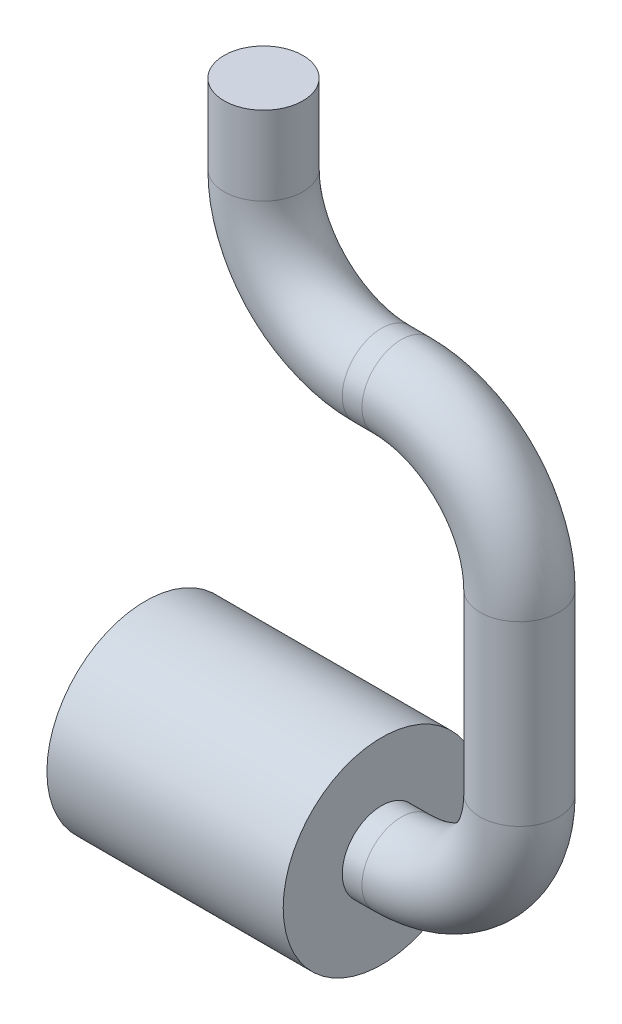
ISO-10303-21;
HEADER;
FILE_DESCRIPTION(('STEP AP214'),'2;1');
FILE_NAME('part.step','',(''),(''),'','','');
FILE_SCHEMA(('AUTOMOTIVE_DESIGN { 1 0 10303 214 1 1 1 1 }'));
ENDSEC;
DATA;
#1=APPLICATION_CONTEXT('core data for automotive mechanical design processes');
#2=APPLICATION_PROTOCOL_DEFINITION('international standard','automotive_design',2000,#1);
#3=PRODUCT_CONTEXT('',#1,'mechanical');
#4=PRODUCT('Part','Part','',(#3));
#5=PRODUCT_RELATED_PRODUCT_CATEGORY('part','',(#4));
#6=PRODUCT_DEFINITION_FORMATION('','',#4);
#7=PRODUCT_DEFINITION_CONTEXT('part definition',#1,'design');
#8=PRODUCT_DEFINITION('design','',#6,#7);
#9=PRODUCT_DEFINITION_SHAPE('','',#8);
#10=(LENGTH_UNIT() NAMED_UNIT(*) SI_UNIT(.MILLI.,.METRE.));
#11=(NAMED_UNIT(*) PLANE_ANGLE_UNIT() SI_UNIT($,.RADIAN.));
#12=(NAMED_UNIT(*) SI_UNIT($,.STERADIAN.) SOLID_ANGLE_UNIT());
#13=UNCERTAINTY_MEASURE_WITH_UNIT(LENGTH_MEASURE(1.E-05),#10,'distance_accuracy_value','');
#14=(GEOMETRIC_REPRESENTATION_CONTEXT(3) GLOBAL_UNCERTAINTY_ASSIGNED_CONTEXT((#13)) GLOBAL_UNIT_ASSIGNED_CONTEXT((#10,
#11,#12)) REPRESENTATION_CONTEXT('',''));
#15=CARTESIAN_POINT('',(0.,0.,0.));
#16=DIRECTION('',(0.,0.,1.));
#17=DIRECTION('',(1.,0.,0.));
#18=AXIS2_PLACEMENT_3D('',#15,#16,#17);
#19=CARTESIAN_POINT('',(15.,0.,0.));
#20=DIRECTION('',(-1.,0.,0.));
#21=DIRECTION('',(0.,0.,1.));
#22=AXIS2_PLACEMENT_3D('',#19,#20,#21);
#23=CYLINDRICAL_SURFACE('',#22,12.5);
#24=CARTESIAN_POINT('',(15.,0.,0.));
#25=DIRECTION('',(1.,0.,0.));
#26=DIRECTION('',(0.,0.,-1.));
#27=AXIS2_PLACEMENT_3D('',#24,#25,#26);
#28=CIRCLE('',#27,12.5);
#29=CARTESIAN_POINT('',(15.,0.,-12.5));
#30=VERTEX_POINT('',#29);
#31=EDGE_CURVE('E53',#30,#30,#28,.T.);
#32=ORIENTED_EDGE('',*,*,#31,.F.);
#33=EDGE_LOOP('',(#32));
#34=FACE_BOUND('',#33,.T.);
#35=CARTESIAN_POINT('',(-15.,0.,0.));
#36=DIRECTION('',(1.,0.,0.));
#37=DIRECTION('',(0.,0.,-1.));
#38=AXIS2_PLACEMENT_3D('',#35,#36,#37);
#39=CIRCLE('',#38,12.5);
#40=CARTESIAN_POINT('',(-15.,0.,-12.5));
#41=VERTEX_POINT('',#40);
#42=EDGE_CURVE('E48',#41,#41,#39,.T.);
#43=ORIENTED_EDGE('',*,*,#42,.T.);
#44=EDGE_LOOP('',(#43));
#45=FACE_BOUND('',#44,.T.);
#46=ADVANCED_FACE('F45',(#34,#45),#23,.T.);
#47=CARTESIAN_POINT('',(15.,0.,0.));
#48=DIRECTION('',(1.,0.,0.));
#49=DIRECTION('',(0.,0.,-1.));
#50=AXIS2_PLACEMENT_3D('',#47,#48,#49);
#51=PLANE('',#50);
#52=CARTESIAN_POINT('',(15.,0.,0.));
#53=DIRECTION('',(1.,0.,0.));
#54=DIRECTION('',(0.,0.,-1.));
#55=AXIS2_PLACEMENT_3D('',#52,#53,#54);
#56=CIRCLE('',#55,5.);
#57=CARTESIAN_POINT('',(15.,0.,-5.));
#58=VERTEX_POINT('',#57);
#59=EDGE_CURVE('E10',#58,#58,#56,.T.);
#60=ORIENTED_EDGE('',*,*,#59,.F.);
#61=EDGE_LOOP('',(#60));
#62=FACE_BOUND('',#61,.T.);
#63=ORIENTED_EDGE('',*,*,#31,.T.);
#64=EDGE_LOOP('',(#63));
#65=FACE_BOUND('',#64,.T.);
#66=ADVANCED_FACE('F97',(#62,#65),#51,.T.);
#67=CARTESIAN_POINT('',(-15.,0.,0.));
#68=DIRECTION('',(1.,0.,0.));
#69=DIRECTION('',(0.,0.,-1.));
#70=AXIS2_PLACEMENT_3D('',#67,#68,#69);
#71=PLANE('',#70);
#72=ORIENTED_EDGE('',*,*,#42,.F.);
#73=EDGE_LOOP('',(#72));
#74=FACE_BOUND('',#73,.T.);
#75=ADVANCED_FACE('F94',(#74),#71,.F.);
#76=CARTESIAN_POINT('',(0.,77.5,0.));
#77=DIRECTION('',(0.,1.,0.));
#78=DIRECTION('',(0.,0.,-1.));
#79=AXIS2_PLACEMENT_3D('',#76,#77,#78);
#80=PLANE('',#79);
#81=CARTESIAN_POINT('',(0.,77.5,0.));
#82=DIRECTION('',(0.,1.,0.));
#83=DIRECTION('',(0.,0.,-1.));
#84=AXIS2_PLACEMENT_3D('',#81,#82,#83);
#85=CIRCLE('',#84,5.);
#86=CARTESIAN_POINT('',(0.,77.5,-5.));
#87=VERTEX_POINT('',#86);
#88=EDGE_CURVE('E84',#87,#87,#85,.T.);
#89=ORIENTED_EDGE('',*,*,#88,.T.);
#90=EDGE_LOOP('',(#89));
#91=FACE_BOUND('',#90,.T.);
#92=ADVANCED_FACE('F96',(#91),#80,.T.);
#93=CARTESIAN_POINT('',(15.,0.,0.));
#94=DIRECTION('',(1.,0.,0.));
#95=DIRECTION('',(0.,0.,-1.));
#96=AXIS2_PLACEMENT_3D('',#93,#94,#95);
#97=CYLINDRICAL_SURFACE('',#96,5.);
#98=CARTESIAN_POINT('',(17.4999999999999,0.,0.));
#99=DIRECTION('',(1.,0.,0.));
#100=DIRECTION('',(0.,0.,-1.));
#101=AXIS2_PLACEMENT_3D('',#98,#99,#100);
#102=CIRCLE('',#101,5.);
#103=CARTESIAN_POINT('',(17.4999999999999,-4.9999999999999,0.));
#104=VERTEX_POINT('',#103);
#105=EDGE_CURVE('E60',#104,#104,#102,.T.);
#106=ORIENTED_EDGE('',*,*,#105,.F.);
#107=EDGE_LOOP('',(#106));
#108=FACE_BOUND('',#107,.T.);
#109=ORIENTED_EDGE('',*,*,#59,.T.);
#110=EDGE_LOOP('',(#109));
#111=FACE_BOUND('',#110,.T.);
#112=ADVANCED_FACE('F104',(#108,#111),#97,.T.);
#113=CARTESIAN_POINT('',(17.5,15.,0.));
#114=DIRECTION('',(0.,0.,1.));
#115=DIRECTION('',(1.,0.,0.));
#116=AXIS2_PLACEMENT_3D('',#113,#114,#115);
#117=TOROIDAL_SURFACE('',#116,14.9999999999999,5.);
#118=CARTESIAN_POINT('',(32.5,15.0000000000001,0.));
#119=DIRECTION('',(0.,1.,0.));
#120=DIRECTION('',(0.,0.,-1.));
#121=AXIS2_PLACEMENT_3D('',#118,#119,#120);
#122=CIRCLE('',#121,5.);
#123=CARTESIAN_POINT('',(37.4999999999999,15.0000000000001,0.));
#124=VERTEX_POINT('',#123);
#125=EDGE_CURVE('E64',#124,#124,#122,.T.);
#126=CARTESIAN_POINT('',(17.5,15.,0.));
#127=DIRECTION('',(0.,0.,1.));
#128=DIRECTION('',(1.,0.,0.));
#129=AXIS2_PLACEMENT_3D('',#126,#127,#128);
#130=CIRCLE('',#129,19.9999999999999);
#131=EDGE_CURVE('',#104,#124,#130,.T.);
#132=ORIENTED_EDGE('',*,*,#105,.T.);
#133=ORIENTED_EDGE('',*,*,#125,.F.);
#134=ORIENTED_EDGE('',*,*,#131,.T.);
#135=ORIENTED_EDGE('',*,*,#131,.F.);
#136=EDGE_LOOP('',(#132,#134,#133,#135));
#137=FACE_BOUND('',#136,.T.);
#138=ADVANCED_FACE('F143',(#137),#117,.T.);
#139=CARTESIAN_POINT('',(32.5,15.0000000000001,0.));
#140=DIRECTION('',(0.,1.,0.));
#141=DIRECTION('',(0.,0.,1.));
#142=AXIS2_PLACEMENT_3D('',#139,#140,#141);
#143=CYLINDRICAL_SURFACE('',#142,5.);
#144=CARTESIAN_POINT('',(32.5,37.4999999999999,0.));
#145=DIRECTION('',(0.,1.,0.));
#146=DIRECTION('',(0.,0.,-1.));
#147=AXIS2_PLACEMENT_3D('',#144,#145,#146);
#148=CIRCLE('',#147,5.);
#149=CARTESIAN_POINT('',(37.5,37.4999999999999,0.));
#150=VERTEX_POINT('',#149);
#151=EDGE_CURVE('E68',#150,#150,#148,.T.);
#152=ORIENTED_EDGE('',*,*,#151,.F.);
#153=EDGE_LOOP('',(#152));
#154=FACE_BOUND('',#153,.T.);
#155=ORIENTED_EDGE('',*,*,#125,.T.);
#156=EDGE_LOOP('',(#155));
#157=FACE_BOUND('',#156,.T.);
#158=ADVANCED_FACE('F153',(#154,#157),#143,.T.);
#159=CARTESIAN_POINT('',(17.5,37.5,0.));
#160=DIRECTION('',(0.,0.,1.));
#161=DIRECTION('',(1.,0.,0.));
#162=AXIS2_PLACEMENT_3D('',#159,#160,#161);
#163=TOROIDAL_SURFACE('',#162,15.,5.);
#164=CARTESIAN_POINT('',(17.4999999999999,52.5,0.));
#165=DIRECTION('',(-1.,0.,0.));
#166=DIRECTION('',(0.,0.,-1.));
#167=AXIS2_PLACEMENT_3D('',#164,#165,#166);
#168=CIRCLE('',#167,5.);
#169=CARTESIAN_POINT('',(17.4999999999999,57.5,0.));
#170=VERTEX_POINT('',#169);
#171=EDGE_CURVE('E72',#170,#170,#168,.T.);
#172=CARTESIAN_POINT('',(17.5,37.5,0.));
#173=DIRECTION('',(0.,0.,1.));
#174=DIRECTION('',(1.,0.,0.));
#175=AXIS2_PLACEMENT_3D('',#172,#173,#174);
#176=CIRCLE('',#175,20.);
#177=EDGE_CURVE('',#150,#170,#176,.T.);
#178=ORIENTED_EDGE('',*,*,#151,.T.);
#179=ORIENTED_EDGE('',*,*,#171,.F.);
#180=ORIENTED_EDGE('',*,*,#177,.T.);
#181=ORIENTED_EDGE('',*,*,#177,.F.);
#182=EDGE_LOOP('',(#178,#180,#179,#181));
#183=FACE_BOUND('',#182,.T.);
#184=ADVANCED_FACE('F163',(#183),#163,.T.);
#185=CARTESIAN_POINT('',(17.4999999999999,52.5,0.));
#186=DIRECTION('',(-1.,0.,0.));
#187=DIRECTION('',(0.,0.,1.));
#188=AXIS2_PLACEMENT_3D('',#185,#186,#187);
#189=CYLINDRICAL_SURFACE('',#188,5.);
#190=CARTESIAN_POINT('',(15.0000000000001,52.5,0.));
#191=DIRECTION('',(-1.,0.,0.));
#192=DIRECTION('',(0.,0.,-1.));
#193=AXIS2_PLACEMENT_3D('',#190,#191,#192);
#194=CIRCLE('',#193,5.);
#195=CARTESIAN_POINT('',(15.0000000000001,47.5,0.));
#196=VERTEX_POINT('',#195);
#197=EDGE_CURVE('E76',#196,#196,#194,.T.);
#198=ORIENTED_EDGE('',*,*,#197,.F.);
#199=EDGE_LOOP('',(#198));
#200=FACE_BOUND('',#199,.T.);
#201=ORIENTED_EDGE('',*,*,#171,.T.);
#202=EDGE_LOOP('',(#201));
#203=FACE_BOUND('',#202,.T.);
#204=ADVANCED_FACE('F173',(#200,#203),#189,.T.);
#205=CARTESIAN_POINT('',(15.,67.5,0.));
#206=DIRECTION('',(0.,0.,-1.));
#207=DIRECTION('',(-1.,0.,0.));
#208=AXIS2_PLACEMENT_3D('',#205,#206,#207);
#209=TOROIDAL_SURFACE('',#208,15.,5.);
#210=CARTESIAN_POINT('',(0.,67.5000000000001,0.));
#211=DIRECTION('',(0.,1.,0.));
#212=DIRECTION('',(0.,0.,-1.));
#213=AXIS2_PLACEMENT_3D('',#210,#211,#212);
#214=CIRCLE('',#213,5.);
#215=CARTESIAN_POINT('',(-5.,67.5000000000001,0.));
#216=VERTEX_POINT('',#215);
#217=EDGE_CURVE('E80',#216,#216,#214,.T.);
#218=CARTESIAN_POINT('',(15.,67.5,0.));
#219=DIRECTION('',(0.,0.,-1.));
#220=DIRECTION('',(-1.,0.,0.));
#221=AXIS2_PLACEMENT_3D('',#218,#219,#220);
#222=CIRCLE('',#221,20.);
#223=EDGE_CURVE('',#196,#216,#222,.T.);
#224=ORIENTED_EDGE('',*,*,#197,.T.);
#225=ORIENTED_EDGE('',*,*,#217,.F.);
#226=ORIENTED_EDGE('',*,*,#223,.T.);
#227=ORIENTED_EDGE('',*,*,#223,.F.);
#228=EDGE_LOOP('',(#224,#226,#225,#227));
#229=FACE_BOUND('',#228,.T.);
#230=ADVANCED_FACE('F109',(#229),#209,.T.);
#231=CARTESIAN_POINT('',(0.,67.5000000000001,0.));
#232=DIRECTION('',(0.,1.,0.));
#233=DIRECTION('',(-1.,0.,0.));
#234=AXIS2_PLACEMENT_3D('',#231,#232,#233);
#235=CYLINDRICAL_SURFACE('',#234,5.);
#236=ORIENTED_EDGE('',*,*,#88,.F.);
#237=EDGE_LOOP('',(#236));
#238=FACE_BOUND('',#237,.T.);
#239=ORIENTED_EDGE('',*,*,#217,.T.);
#240=EDGE_LOOP('',(#239));
#241=FACE_BOUND('',#240,.T.);
#242=ADVANCED_FACE('F98',(#238,#241),#235,.T.);
#243=CLOSED_SHELL('',(#46,#66,#75,#92,#112,#138,#158,#184,#204,#230,#242));
#244=MANIFOLD_SOLID_BREP('B2',#243);
#245=ADVANCED_BREP_SHAPE_REPRESENTATION('',(#18,#244),#14);
#246=SHAPE_DEFINITION_REPRESENTATION(#9,#245);
ENDSEC;
END-ISO-10303-21;
